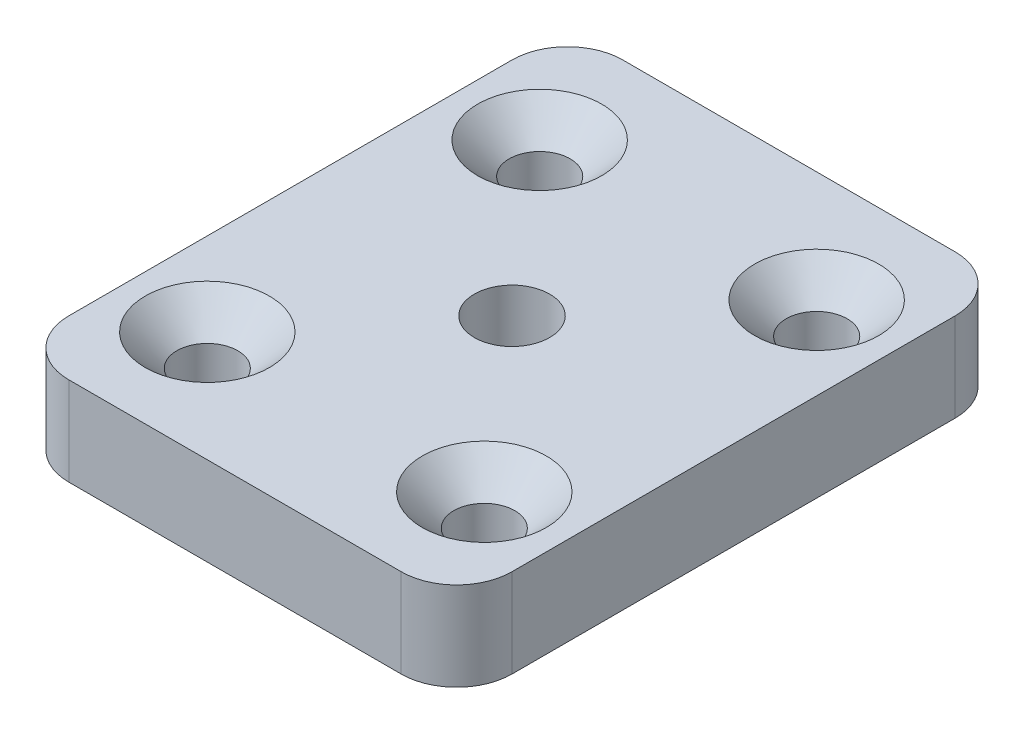
ISO-10303-21;
HEADER;
FILE_DESCRIPTION(('STEP AP214'),'2;1');
FILE_NAME('part.step','',(''),(''),'','','');
FILE_SCHEMA(('AUTOMOTIVE_DESIGN { 1 0 10303 214 1 1 1 1 }'));
ENDSEC;
DATA;
#1=APPLICATION_CONTEXT('core data for automotive mechanical design processes');
#2=APPLICATION_PROTOCOL_DEFINITION('international standard','automotive_design',2000,#1);
#3=PRODUCT_CONTEXT('',#1,'mechanical');
#4=PRODUCT('Part','Part','',(#3));
#5=PRODUCT_RELATED_PRODUCT_CATEGORY('part','',(#4));
#6=PRODUCT_DEFINITION_FORMATION('','',#4);
#7=PRODUCT_DEFINITION_CONTEXT('part definition',#1,'design');
#8=PRODUCT_DEFINITION('design','',#6,#7);
#9=PRODUCT_DEFINITION_SHAPE('','',#8);
#10=(LENGTH_UNIT() NAMED_UNIT(*) SI_UNIT(.MILLI.,.METRE.));
#11=(NAMED_UNIT(*) PLANE_ANGLE_UNIT() SI_UNIT($,.RADIAN.));
#12=(NAMED_UNIT(*) SI_UNIT($,.STERADIAN.) SOLID_ANGLE_UNIT());
#13=UNCERTAINTY_MEASURE_WITH_UNIT(LENGTH_MEASURE(1.E-05),#10,'distance_accuracy_value','');
#14=(GEOMETRIC_REPRESENTATION_CONTEXT(3) GLOBAL_UNCERTAINTY_ASSIGNED_CONTEXT((#13)) GLOBAL_UNIT_ASSIGNED_CONTEXT((#10,
#11,#12)) REPRESENTATION_CONTEXT('',''));
#15=CARTESIAN_POINT('',(0.,0.,0.));
#16=DIRECTION('',(0.,0.,1.));
#17=DIRECTION('',(1.,0.,0.));
#18=AXIS2_PLACEMENT_3D('',#15,#16,#17);
#19=CARTESIAN_POINT('',(20.,8.,25.));
#20=DIRECTION('',(-1.,0.,0.));
#21=DIRECTION('',(0.,0.,1.));
#22=AXIS2_PLACEMENT_3D('',#19,#20,#21);
#23=PLANE('',#22);
#24=DIRECTION('',(0.,0.,-1.));
#25=VECTOR('',#24,1.);
#26=CARTESIAN_POINT('',(20.,8.,25.));
#27=LINE('',#26,#25);
#28=CARTESIAN_POINT('',(20.,8.,20.));
#29=VERTEX_POINT('',#28);
#30=CARTESIAN_POINT('',(20.,8.,-20.));
#31=VERTEX_POINT('',#30);
#32=EDGE_CURVE('E129',#29,#31,#27,.T.);
#33=ORIENTED_EDGE('',*,*,#32,.F.);
#34=DIRECTION('',(0.,-1.,0.));
#35=VECTOR('',#34,1.);
#36=CARTESIAN_POINT('',(20.,8.,20.));
#37=LINE('',#36,#35);
#38=CARTESIAN_POINT('',(20.,0.,20.));
#39=VERTEX_POINT('',#38);
#40=EDGE_CURVE('E113',#29,#39,#37,.T.);
#41=ORIENTED_EDGE('',*,*,#40,.T.);
#42=DIRECTION('',(0.,0.,-1.));
#43=VECTOR('',#42,1.);
#44=CARTESIAN_POINT('',(20.,0.,25.));
#45=LINE('',#44,#43);
#46=CARTESIAN_POINT('',(20.,0.,-20.));
#47=VERTEX_POINT('',#46);
#48=EDGE_CURVE('E126',#39,#47,#45,.T.);
#49=ORIENTED_EDGE('',*,*,#48,.T.);
#50=DIRECTION('',(0.,-1.,0.));
#51=VECTOR('',#50,1.);
#52=CARTESIAN_POINT('',(20.,8.,-20.));
#53=LINE('',#52,#51);
#54=EDGE_CURVE('E132',#47,#31,#53,.F.);
#55=ORIENTED_EDGE('',*,*,#54,.T.);
#56=EDGE_LOOP('',(#33,#41,#49,#55));
#57=FACE_BOUND('',#56,.T.);
#58=ADVANCED_FACE('F42',(#57),#23,.F.);
#59=CARTESIAN_POINT('',(-20.,8.,-25.));
#60=DIRECTION('',(0.,0.,1.));
#61=DIRECTION('',(1.,0.,0.));
#62=AXIS2_PLACEMENT_3D('',#59,#60,#61);
#63=PLANE('',#62);
#64=DIRECTION('',(-1.,0.,0.));
#65=VECTOR('',#64,1.);
#66=CARTESIAN_POINT('',(-20.,0.,-25.));
#67=LINE('',#66,#65);
#68=CARTESIAN_POINT('',(15.,0.,-25.));
#69=VERTEX_POINT('',#68);
#70=CARTESIAN_POINT('',(-15.,0.,-25.));
#71=VERTEX_POINT('',#70);
#72=EDGE_CURVE('E137',#69,#71,#67,.T.);
#73=ORIENTED_EDGE('',*,*,#72,.T.);
#74=DIRECTION('',(0.,-1.,0.));
#75=VECTOR('',#74,1.);
#76=CARTESIAN_POINT('',(-15.,8.,-25.));
#77=LINE('',#76,#75);
#78=CARTESIAN_POINT('',(-15.,8.,-25.));
#79=VERTEX_POINT('',#78);
#80=EDGE_CURVE('E11',#71,#79,#77,.F.);
#81=ORIENTED_EDGE('',*,*,#80,.T.);
#82=DIRECTION('',(-1.,0.,0.));
#83=VECTOR('',#82,1.);
#84=CARTESIAN_POINT('',(-20.,8.,-25.));
#85=LINE('',#84,#83);
#86=CARTESIAN_POINT('',(15.,8.,-25.));
#87=VERTEX_POINT('',#86);
#88=EDGE_CURVE('E196',#87,#79,#85,.T.);
#89=ORIENTED_EDGE('',*,*,#88,.F.);
#90=DIRECTION('',(0.,-1.,0.));
#91=VECTOR('',#90,1.);
#92=CARTESIAN_POINT('',(15.,8.,-25.));
#93=LINE('',#92,#91);
#94=EDGE_CURVE('E51',#87,#69,#93,.T.);
#95=ORIENTED_EDGE('',*,*,#94,.T.);
#96=EDGE_LOOP('',(#73,#81,#89,#95));
#97=FACE_BOUND('',#96,.T.);
#98=ADVANCED_FACE('F194',(#97),#63,.F.);
#99=CARTESIAN_POINT('',(-20.,8.,25.));
#100=DIRECTION('',(1.,0.,0.));
#101=DIRECTION('',(0.,0.,-1.));
#102=AXIS2_PLACEMENT_3D('',#99,#100,#101);
#103=PLANE('',#102);
#104=DIRECTION('',(0.,0.,1.));
#105=VECTOR('',#104,1.);
#106=CARTESIAN_POINT('',(-20.,0.,25.));
#107=LINE('',#106,#105);
#108=CARTESIAN_POINT('',(-20.,0.,-20.));
#109=VERTEX_POINT('',#108);
#110=CARTESIAN_POINT('',(-20.,0.,20.));
#111=VERTEX_POINT('',#110);
#112=EDGE_CURVE('E144',#109,#111,#107,.T.);
#113=ORIENTED_EDGE('',*,*,#112,.T.);
#114=DIRECTION('',(0.,-1.,0.));
#115=VECTOR('',#114,1.);
#116=CARTESIAN_POINT('',(-20.,8.,20.));
#117=LINE('',#116,#115);
#118=CARTESIAN_POINT('',(-20.,8.,20.));
#119=VERTEX_POINT('',#118);
#120=EDGE_CURVE('E58',#111,#119,#117,.F.);
#121=ORIENTED_EDGE('',*,*,#120,.T.);
#122=DIRECTION('',(0.,0.,1.));
#123=VECTOR('',#122,1.);
#124=CARTESIAN_POINT('',(-20.,8.,25.));
#125=LINE('',#124,#123);
#126=CARTESIAN_POINT('',(-20.,8.,-20.));
#127=VERTEX_POINT('',#126);
#128=EDGE_CURVE('E204',#127,#119,#125,.T.);
#129=ORIENTED_EDGE('',*,*,#128,.F.);
#130=DIRECTION('',(0.,-1.,0.));
#131=VECTOR('',#130,1.);
#132=CARTESIAN_POINT('',(-20.,8.,-20.));
#133=LINE('',#132,#131);
#134=EDGE_CURVE('E183',#127,#109,#133,.T.);
#135=ORIENTED_EDGE('',*,*,#134,.T.);
#136=EDGE_LOOP('',(#113,#121,#129,#135));
#137=FACE_BOUND('',#136,.T.);
#138=ADVANCED_FACE('F203',(#137),#103,.F.);
#139=CARTESIAN_POINT('',(-20.,8.,25.));
#140=DIRECTION('',(0.,0.,-1.));
#141=DIRECTION('',(-1.,0.,0.));
#142=AXIS2_PLACEMENT_3D('',#139,#140,#141);
#143=PLANE('',#142);
#144=DIRECTION('',(1.,0.,0.));
#145=VECTOR('',#144,1.);
#146=CARTESIAN_POINT('',(-20.,0.,25.));
#147=LINE('',#146,#145);
#148=CARTESIAN_POINT('',(-15.,0.,25.));
#149=VERTEX_POINT('',#148);
#150=CARTESIAN_POINT('',(15.,0.,25.));
#151=VERTEX_POINT('',#150);
#152=EDGE_CURVE('E155',#149,#151,#147,.T.);
#153=ORIENTED_EDGE('',*,*,#152,.T.);
#154=DIRECTION('',(0.,-1.,0.));
#155=VECTOR('',#154,1.);
#156=CARTESIAN_POINT('',(15.,8.,25.));
#157=LINE('',#156,#155);
#158=CARTESIAN_POINT('',(15.,8.,25.));
#159=VERTEX_POINT('',#158);
#160=EDGE_CURVE('E114',#151,#159,#157,.F.);
#161=ORIENTED_EDGE('',*,*,#160,.T.);
#162=DIRECTION('',(1.,0.,0.));
#163=VECTOR('',#162,1.);
#164=CARTESIAN_POINT('',(-20.,8.,25.));
#165=LINE('',#164,#163);
#166=CARTESIAN_POINT('',(-15.,8.,25.));
#167=VERTEX_POINT('',#166);
#168=EDGE_CURVE('E150',#167,#159,#165,.T.);
#169=ORIENTED_EDGE('',*,*,#168,.F.);
#170=DIRECTION('',(0.,-1.,0.));
#171=VECTOR('',#170,1.);
#172=CARTESIAN_POINT('',(-15.,8.,25.));
#173=LINE('',#172,#171);
#174=EDGE_CURVE('E120',#167,#149,#173,.T.);
#175=ORIENTED_EDGE('',*,*,#174,.T.);
#176=EDGE_LOOP('',(#153,#161,#169,#175));
#177=FACE_BOUND('',#176,.T.);
#178=ADVANCED_FACE('F273',(#177),#143,.F.);
#179=CARTESIAN_POINT('',(0.,8.,0.));
#180=DIRECTION('',(0.,-1.,0.));
#181=DIRECTION('',(0.,0.,-1.));
#182=AXIS2_PLACEMENT_3D('',#179,#180,#181);
#183=PLANE('',#182);
#184=CARTESIAN_POINT('',(0.,8.,0.));
#185=DIRECTION('',(0.,1.,0.));
#186=DIRECTION('',(0.,0.,1.));
#187=AXIS2_PLACEMENT_3D('',#184,#185,#186);
#188=CIRCLE('',#187,3.4);
#189=CARTESIAN_POINT('',(0.,8.,3.4));
#190=VERTEX_POINT('',#189);
#191=EDGE_CURVE('E262',#190,#190,#188,.T.);
#192=ORIENTED_EDGE('',*,*,#191,.F.);
#193=EDGE_LOOP('',(#192));
#194=FACE_BOUND('',#193,.T.);
#195=CARTESIAN_POINT('',(-12.5,8.,-15.));
#196=DIRECTION('',(0.,1.,0.));
#197=DIRECTION('',(0.,0.,1.));
#198=AXIS2_PLACEMENT_3D('',#195,#196,#197);
#199=CIRCLE('',#198,5.6);
#200=CARTESIAN_POINT('',(-12.5,8.,-9.4));
#201=VERTEX_POINT('',#200);
#202=EDGE_CURVE('E254',#201,#201,#199,.T.);
#203=ORIENTED_EDGE('',*,*,#202,.F.);
#204=EDGE_LOOP('',(#203));
#205=FACE_BOUND('',#204,.T.);
#206=CARTESIAN_POINT('',(-12.5,8.,15.));
#207=DIRECTION('',(0.,1.,0.));
#208=DIRECTION('',(0.,0.,1.));
#209=AXIS2_PLACEMENT_3D('',#206,#207,#208);
#210=CIRCLE('',#209,5.6);
#211=CARTESIAN_POINT('',(-12.5,8.,20.6));
#212=VERTEX_POINT('',#211);
#213=EDGE_CURVE('E242',#212,#212,#210,.T.);
#214=ORIENTED_EDGE('',*,*,#213,.F.);
#215=EDGE_LOOP('',(#214));
#216=FACE_BOUND('',#215,.T.);
#217=CARTESIAN_POINT('',(12.5,8.,15.));
#218=DIRECTION('',(0.,1.,0.));
#219=DIRECTION('',(0.,0.,1.));
#220=AXIS2_PLACEMENT_3D('',#217,#218,#219);
#221=CIRCLE('',#220,5.6);
#222=CARTESIAN_POINT('',(12.5,8.,20.6));
#223=VERTEX_POINT('',#222);
#224=EDGE_CURVE('E230',#223,#223,#221,.T.);
#225=ORIENTED_EDGE('',*,*,#224,.F.);
#226=EDGE_LOOP('',(#225));
#227=FACE_BOUND('',#226,.T.);
#228=CARTESIAN_POINT('',(12.5,8.,-15.));
#229=DIRECTION('',(0.,1.,0.));
#230=DIRECTION('',(0.,0.,1.));
#231=AXIS2_PLACEMENT_3D('',#228,#229,#230);
#232=CIRCLE('',#231,5.6);
#233=CARTESIAN_POINT('',(12.5,8.,-9.4));
#234=VERTEX_POINT('',#233);
#235=EDGE_CURVE('E218',#234,#234,#232,.T.);
#236=ORIENTED_EDGE('',*,*,#235,.F.);
#237=EDGE_LOOP('',(#236));
#238=FACE_BOUND('',#237,.T.);
#239=ORIENTED_EDGE('',*,*,#168,.T.);
#240=CARTESIAN_POINT('',(15.,8.,20.));
#241=DIRECTION('',(0.,-1.,0.));
#242=DIRECTION('',(0.,0.,-1.));
#243=AXIS2_PLACEMENT_3D('',#240,#241,#242);
#244=CIRCLE('',#243,5.);
#245=EDGE_CURVE('E180',#159,#29,#244,.F.);
#246=ORIENTED_EDGE('',*,*,#245,.T.);
#247=ORIENTED_EDGE('',*,*,#32,.T.);
#248=CARTESIAN_POINT('',(15.,8.,-20.));
#249=DIRECTION('',(0.,-1.,0.));
#250=DIRECTION('',(0.,0.,-1.));
#251=AXIS2_PLACEMENT_3D('',#248,#249,#250);
#252=CIRCLE('',#251,5.);
#253=EDGE_CURVE('E172',#31,#87,#252,.F.);
#254=ORIENTED_EDGE('',*,*,#253,.T.);
#255=ORIENTED_EDGE('',*,*,#88,.T.);
#256=CARTESIAN_POINT('',(-15.,8.,-20.));
#257=DIRECTION('',(0.,-1.,0.));
#258=DIRECTION('',(0.,0.,-1.));
#259=AXIS2_PLACEMENT_3D('',#256,#257,#258);
#260=CIRCLE('',#259,5.);
#261=EDGE_CURVE('E65',#79,#127,#260,.F.);
#262=ORIENTED_EDGE('',*,*,#261,.T.);
#263=ORIENTED_EDGE('',*,*,#128,.T.);
#264=CARTESIAN_POINT('',(-15.,8.,20.));
#265=DIRECTION('',(0.,-1.,0.));
#266=DIRECTION('',(0.,0.,-1.));
#267=AXIS2_PLACEMENT_3D('',#264,#265,#266);
#268=CIRCLE('',#267,5.);
#269=EDGE_CURVE('E177',#119,#167,#268,.F.);
#270=ORIENTED_EDGE('',*,*,#269,.T.);
#271=EDGE_LOOP('',(#239,#246,#247,#254,#255,#262,#263,#270));
#272=FACE_BOUND('',#271,.T.);
#273=ADVANCED_FACE('F270',(#194,#205,#216,#227,#238,#272),#183,.F.);
#274=CARTESIAN_POINT('',(0.,0.,0.));
#275=DIRECTION('',(0.,-1.,0.));
#276=DIRECTION('',(0.,0.,-1.));
#277=AXIS2_PLACEMENT_3D('',#274,#275,#276);
#278=PLANE('',#277);
#279=CARTESIAN_POINT('',(0.,0.,0.));
#280=DIRECTION('',(0.,1.,0.));
#281=DIRECTION('',(0.,0.,1.));
#282=AXIS2_PLACEMENT_3D('',#279,#280,#281);
#283=CIRCLE('',#282,3.4);
#284=CARTESIAN_POINT('',(0.,0.,3.4));
#285=VERTEX_POINT('',#284);
#286=EDGE_CURVE('E258',#285,#285,#283,.T.);
#287=ORIENTED_EDGE('',*,*,#286,.T.);
#288=EDGE_LOOP('',(#287));
#289=FACE_BOUND('',#288,.T.);
#290=CARTESIAN_POINT('',(-12.5,0.,-15.));
#291=DIRECTION('',(0.,1.,0.));
#292=DIRECTION('',(0.,0.,1.));
#293=AXIS2_PLACEMENT_3D('',#290,#291,#292);
#294=CIRCLE('',#293,2.74999999999999);
#295=CARTESIAN_POINT('',(-12.5,0.,-12.25));
#296=VERTEX_POINT('',#295);
#297=EDGE_CURVE('E246',#296,#296,#294,.T.);
#298=ORIENTED_EDGE('',*,*,#297,.T.);
#299=EDGE_LOOP('',(#298));
#300=FACE_BOUND('',#299,.T.);
#301=CARTESIAN_POINT('',(-12.5,0.,15.));
#302=DIRECTION('',(0.,1.,0.));
#303=DIRECTION('',(0.,0.,1.));
#304=AXIS2_PLACEMENT_3D('',#301,#302,#303);
#305=CIRCLE('',#304,2.74999999999999);
#306=CARTESIAN_POINT('',(-12.5,0.,17.75));
#307=VERTEX_POINT('',#306);
#308=EDGE_CURVE('E234',#307,#307,#305,.T.);
#309=ORIENTED_EDGE('',*,*,#308,.T.);
#310=EDGE_LOOP('',(#309));
#311=FACE_BOUND('',#310,.T.);
#312=CARTESIAN_POINT('',(12.5,0.,15.));
#313=DIRECTION('',(0.,1.,0.));
#314=DIRECTION('',(0.,0.,1.));
#315=AXIS2_PLACEMENT_3D('',#312,#313,#314);
#316=CIRCLE('',#315,2.74999999999999);
#317=CARTESIAN_POINT('',(12.5,0.,17.75));
#318=VERTEX_POINT('',#317);
#319=EDGE_CURVE('E222',#318,#318,#316,.T.);
#320=ORIENTED_EDGE('',*,*,#319,.T.);
#321=EDGE_LOOP('',(#320));
#322=FACE_BOUND('',#321,.T.);
#323=CARTESIAN_POINT('',(12.5,0.,-15.));
#324=DIRECTION('',(0.,1.,0.));
#325=DIRECTION('',(0.,0.,1.));
#326=AXIS2_PLACEMENT_3D('',#323,#324,#325);
#327=CIRCLE('',#326,2.74999999999999);
#328=CARTESIAN_POINT('',(12.5,0.,-12.25));
#329=VERTEX_POINT('',#328);
#330=EDGE_CURVE('E138',#329,#329,#327,.T.);
#331=ORIENTED_EDGE('',*,*,#330,.T.);
#332=EDGE_LOOP('',(#331));
#333=FACE_BOUND('',#332,.T.);
#334=ORIENTED_EDGE('',*,*,#48,.F.);
#335=CARTESIAN_POINT('',(15.,0.,20.));
#336=DIRECTION('',(0.,-1.,0.));
#337=DIRECTION('',(0.,0.,-1.));
#338=AXIS2_PLACEMENT_3D('',#335,#336,#337);
#339=CIRCLE('',#338,5.);
#340=EDGE_CURVE('E109',#39,#151,#339,.T.);
#341=ORIENTED_EDGE('',*,*,#340,.T.);
#342=ORIENTED_EDGE('',*,*,#152,.F.);
#343=CARTESIAN_POINT('',(-15.,0.,20.));
#344=DIRECTION('',(0.,-1.,0.));
#345=DIRECTION('',(0.,0.,-1.));
#346=AXIS2_PLACEMENT_3D('',#343,#344,#345);
#347=CIRCLE('',#346,5.);
#348=EDGE_CURVE('E121',#149,#111,#347,.T.);
#349=ORIENTED_EDGE('',*,*,#348,.T.);
#350=ORIENTED_EDGE('',*,*,#112,.F.);
#351=CARTESIAN_POINT('',(-15.,0.,-20.));
#352=DIRECTION('',(0.,-1.,0.));
#353=DIRECTION('',(0.,0.,-1.));
#354=AXIS2_PLACEMENT_3D('',#351,#352,#353);
#355=CIRCLE('',#354,5.);
#356=EDGE_CURVE('E162',#109,#71,#355,.T.);
#357=ORIENTED_EDGE('',*,*,#356,.T.);
#358=ORIENTED_EDGE('',*,*,#72,.F.);
#359=CARTESIAN_POINT('',(15.,0.,-20.));
#360=DIRECTION('',(0.,-1.,0.));
#361=DIRECTION('',(0.,0.,-1.));
#362=AXIS2_PLACEMENT_3D('',#359,#360,#361);
#363=CIRCLE('',#362,5.);
#364=EDGE_CURVE('E131',#69,#47,#363,.T.);
#365=ORIENTED_EDGE('',*,*,#364,.T.);
#366=EDGE_LOOP('',(#334,#341,#342,#349,#350,#357,#358,#365));
#367=FACE_BOUND('',#366,.T.);
#368=ADVANCED_FACE('F134',(#289,#300,#311,#322,#333,#367),#278,.T.);
#369=CARTESIAN_POINT('',(12.5,8.,-15.));
#370=DIRECTION('',(0.,1.,0.));
#371=DIRECTION('',(0.,0.,1.));
#372=AXIS2_PLACEMENT_3D('',#369,#370,#371);
#373=CYLINDRICAL_SURFACE('',#372,2.74999999999999);
#374=ORIENTED_EDGE('',*,*,#330,.F.);
#375=EDGE_LOOP('',(#374));
#376=FACE_BOUND('',#375,.T.);
#377=CARTESIAN_POINT('',(12.5,5.15,-15.));
#378=DIRECTION('',(0.,1.,0.));
#379=DIRECTION('',(0.,0.,1.));
#380=AXIS2_PLACEMENT_3D('',#377,#378,#379);
#381=CIRCLE('',#380,2.75);
#382=CARTESIAN_POINT('',(12.5,5.15,-12.25));
#383=VERTEX_POINT('',#382);
#384=EDGE_CURVE('E147',#383,#383,#381,.T.);
#385=ORIENTED_EDGE('',*,*,#384,.T.);
#386=EDGE_LOOP('',(#385));
#387=FACE_BOUND('',#386,.T.);
#388=ADVANCED_FACE('F306',(#376,#387),#373,.F.);
#389=CARTESIAN_POINT('',(12.5,8.,-15.));
#390=DIRECTION('',(0.,1.,0.));
#391=DIRECTION('',(0.,0.,1.));
#392=AXIS2_PLACEMENT_3D('',#389,#390,#391);
#393=CONICAL_SURFACE('',#392,5.6,0.785398163397449);
#394=ORIENTED_EDGE('',*,*,#384,.F.);
#395=EDGE_LOOP('',(#394));
#396=FACE_BOUND('',#395,.T.);
#397=ORIENTED_EDGE('',*,*,#235,.T.);
#398=EDGE_LOOP('',(#397));
#399=FACE_BOUND('',#398,.T.);
#400=ADVANCED_FACE('F311',(#396,#399),#393,.F.);
#401=CARTESIAN_POINT('',(12.5,8.,15.));
#402=DIRECTION('',(0.,1.,0.));
#403=DIRECTION('',(0.,0.,1.));
#404=AXIS2_PLACEMENT_3D('',#401,#402,#403);
#405=CYLINDRICAL_SURFACE('',#404,2.74999999999999);
#406=ORIENTED_EDGE('',*,*,#319,.F.);
#407=EDGE_LOOP('',(#406));
#408=FACE_BOUND('',#407,.T.);
#409=CARTESIAN_POINT('',(12.5,5.15,15.));
#410=DIRECTION('',(0.,1.,0.));
#411=DIRECTION('',(0.,0.,1.));
#412=AXIS2_PLACEMENT_3D('',#409,#410,#411);
#413=CIRCLE('',#412,2.75);
#414=CARTESIAN_POINT('',(12.5,5.15,17.75));
#415=VERTEX_POINT('',#414);
#416=EDGE_CURVE('E226',#415,#415,#413,.T.);
#417=ORIENTED_EDGE('',*,*,#416,.T.);
#418=EDGE_LOOP('',(#417));
#419=FACE_BOUND('',#418,.T.);
#420=ADVANCED_FACE('F315',(#408,#419),#405,.F.);
#421=CARTESIAN_POINT('',(12.5,8.,15.));
#422=DIRECTION('',(0.,1.,0.));
#423=DIRECTION('',(0.,0.,1.));
#424=AXIS2_PLACEMENT_3D('',#421,#422,#423);
#425=CONICAL_SURFACE('',#424,5.6,0.785398163397449);
#426=ORIENTED_EDGE('',*,*,#416,.F.);
#427=EDGE_LOOP('',(#426));
#428=FACE_BOUND('',#427,.T.);
#429=ORIENTED_EDGE('',*,*,#224,.T.);
#430=EDGE_LOOP('',(#429));
#431=FACE_BOUND('',#430,.T.);
#432=ADVANCED_FACE('F319',(#428,#431),#425,.F.);
#433=CARTESIAN_POINT('',(-12.5,8.,15.));
#434=DIRECTION('',(0.,1.,0.));
#435=DIRECTION('',(0.,0.,1.));
#436=AXIS2_PLACEMENT_3D('',#433,#434,#435);
#437=CYLINDRICAL_SURFACE('',#436,2.74999999999999);
#438=ORIENTED_EDGE('',*,*,#308,.F.);
#439=EDGE_LOOP('',(#438));
#440=FACE_BOUND('',#439,.T.);
#441=CARTESIAN_POINT('',(-12.5,5.15,15.));
#442=DIRECTION('',(0.,1.,0.));
#443=DIRECTION('',(0.,0.,1.));
#444=AXIS2_PLACEMENT_3D('',#441,#442,#443);
#445=CIRCLE('',#444,2.75);
#446=CARTESIAN_POINT('',(-12.5,5.15,17.75));
#447=VERTEX_POINT('',#446);
#448=EDGE_CURVE('E238',#447,#447,#445,.T.);
#449=ORIENTED_EDGE('',*,*,#448,.T.);
#450=EDGE_LOOP('',(#449));
#451=FACE_BOUND('',#450,.T.);
#452=ADVANCED_FACE('F323',(#440,#451),#437,.F.);
#453=CARTESIAN_POINT('',(-12.5,8.,15.));
#454=DIRECTION('',(0.,1.,0.));
#455=DIRECTION('',(0.,0.,1.));
#456=AXIS2_PLACEMENT_3D('',#453,#454,#455);
#457=CONICAL_SURFACE('',#456,5.6,0.785398163397449);
#458=ORIENTED_EDGE('',*,*,#448,.F.);
#459=EDGE_LOOP('',(#458));
#460=FACE_BOUND('',#459,.T.);
#461=ORIENTED_EDGE('',*,*,#213,.T.);
#462=EDGE_LOOP('',(#461));
#463=FACE_BOUND('',#462,.T.);
#464=ADVANCED_FACE('F327',(#460,#463),#457,.F.);
#465=CARTESIAN_POINT('',(-12.5,8.,-15.));
#466=DIRECTION('',(0.,1.,0.));
#467=DIRECTION('',(0.,0.,1.));
#468=AXIS2_PLACEMENT_3D('',#465,#466,#467);
#469=CYLINDRICAL_SURFACE('',#468,2.74999999999999);
#470=ORIENTED_EDGE('',*,*,#297,.F.);
#471=EDGE_LOOP('',(#470));
#472=FACE_BOUND('',#471,.T.);
#473=CARTESIAN_POINT('',(-12.5,5.15,-15.));
#474=DIRECTION('',(0.,1.,0.));
#475=DIRECTION('',(0.,0.,1.));
#476=AXIS2_PLACEMENT_3D('',#473,#474,#475);
#477=CIRCLE('',#476,2.75);
#478=CARTESIAN_POINT('',(-12.5,5.15,-12.25));
#479=VERTEX_POINT('',#478);
#480=EDGE_CURVE('E250',#479,#479,#477,.T.);
#481=ORIENTED_EDGE('',*,*,#480,.T.);
#482=EDGE_LOOP('',(#481));
#483=FACE_BOUND('',#482,.T.);
#484=ADVANCED_FACE('F331',(#472,#483),#469,.F.);
#485=CARTESIAN_POINT('',(-12.5,8.,-15.));
#486=DIRECTION('',(0.,1.,0.));
#487=DIRECTION('',(0.,0.,1.));
#488=AXIS2_PLACEMENT_3D('',#485,#486,#487);
#489=CONICAL_SURFACE('',#488,5.6,0.785398163397449);
#490=ORIENTED_EDGE('',*,*,#480,.F.);
#491=EDGE_LOOP('',(#490));
#492=FACE_BOUND('',#491,.T.);
#493=ORIENTED_EDGE('',*,*,#202,.T.);
#494=EDGE_LOOP('',(#493));
#495=FACE_BOUND('',#494,.T.);
#496=ADVANCED_FACE('F335',(#492,#495),#489,.F.);
#497=CARTESIAN_POINT('',(0.,8.,0.));
#498=DIRECTION('',(0.,1.,0.));
#499=DIRECTION('',(0.,0.,1.));
#500=AXIS2_PLACEMENT_3D('',#497,#498,#499);
#501=CYLINDRICAL_SURFACE('',#500,3.4);
#502=ORIENTED_EDGE('',*,*,#286,.F.);
#503=EDGE_LOOP('',(#502));
#504=FACE_BOUND('',#503,.T.);
#505=ORIENTED_EDGE('',*,*,#191,.T.);
#506=EDGE_LOOP('',(#505));
#507=FACE_BOUND('',#506,.T.);
#508=ADVANCED_FACE('F268',(#504,#507),#501,.F.);
#509=CARTESIAN_POINT('',(15.,8.,20.));
#510=DIRECTION('',(0.,-1.,0.));
#511=DIRECTION('',(0.,0.,-1.));
#512=AXIS2_PLACEMENT_3D('',#509,#510,#511);
#513=CYLINDRICAL_SURFACE('',#512,5.);
#514=ORIENTED_EDGE('',*,*,#245,.F.);
#515=ORIENTED_EDGE('',*,*,#160,.F.);
#516=ORIENTED_EDGE('',*,*,#340,.F.);
#517=ORIENTED_EDGE('',*,*,#40,.F.);
#518=EDGE_LOOP('',(#514,#515,#516,#517));
#519=FACE_BOUND('',#518,.T.);
#520=ADVANCED_FACE('F112',(#519),#513,.T.);
#521=CARTESIAN_POINT('',(-15.,8.,20.));
#522=DIRECTION('',(0.,-1.,0.));
#523=DIRECTION('',(0.,0.,-1.));
#524=AXIS2_PLACEMENT_3D('',#521,#522,#523);
#525=CYLINDRICAL_SURFACE('',#524,5.);
#526=ORIENTED_EDGE('',*,*,#269,.F.);
#527=ORIENTED_EDGE('',*,*,#120,.F.);
#528=ORIENTED_EDGE('',*,*,#348,.F.);
#529=ORIENTED_EDGE('',*,*,#174,.F.);
#530=EDGE_LOOP('',(#526,#527,#528,#529));
#531=FACE_BOUND('',#530,.T.);
#532=ADVANCED_FACE('F286',(#531),#525,.T.);
#533=CARTESIAN_POINT('',(-15.,8.,-20.));
#534=DIRECTION('',(0.,-1.,0.));
#535=DIRECTION('',(0.,0.,-1.));
#536=AXIS2_PLACEMENT_3D('',#533,#534,#535);
#537=CYLINDRICAL_SURFACE('',#536,5.);
#538=ORIENTED_EDGE('',*,*,#261,.F.);
#539=ORIENTED_EDGE('',*,*,#80,.F.);
#540=ORIENTED_EDGE('',*,*,#356,.F.);
#541=ORIENTED_EDGE('',*,*,#134,.F.);
#542=EDGE_LOOP('',(#538,#539,#540,#541));
#543=FACE_BOUND('',#542,.T.);
#544=ADVANCED_FACE('F202',(#543),#537,.T.);
#545=CARTESIAN_POINT('',(15.,8.,-20.));
#546=DIRECTION('',(0.,-1.,0.));
#547=DIRECTION('',(0.,0.,-1.));
#548=AXIS2_PLACEMENT_3D('',#545,#546,#547);
#549=CYLINDRICAL_SURFACE('',#548,5.);
#550=ORIENTED_EDGE('',*,*,#253,.F.);
#551=ORIENTED_EDGE('',*,*,#54,.F.);
#552=ORIENTED_EDGE('',*,*,#364,.F.);
#553=ORIENTED_EDGE('',*,*,#94,.F.);
#554=EDGE_LOOP('',(#550,#551,#552,#553));
#555=FACE_BOUND('',#554,.T.);
#556=ADVANCED_FACE('F44',(#555),#549,.T.);
#557=CLOSED_SHELL('',(#58,#98,#138,#178,#273,#368,#388,#400,#420,#432,#452,#464,#484,#496,#508,
#520,#532,#544,#556));
#558=MANIFOLD_SOLID_BREP('B2',#557);
#559=ADVANCED_BREP_SHAPE_REPRESENTATION('',(#18,#558),#14);
#560=SHAPE_DEFINITION_REPRESENTATION(#9,#559);
ENDSEC;
END-ISO-10303-21;
